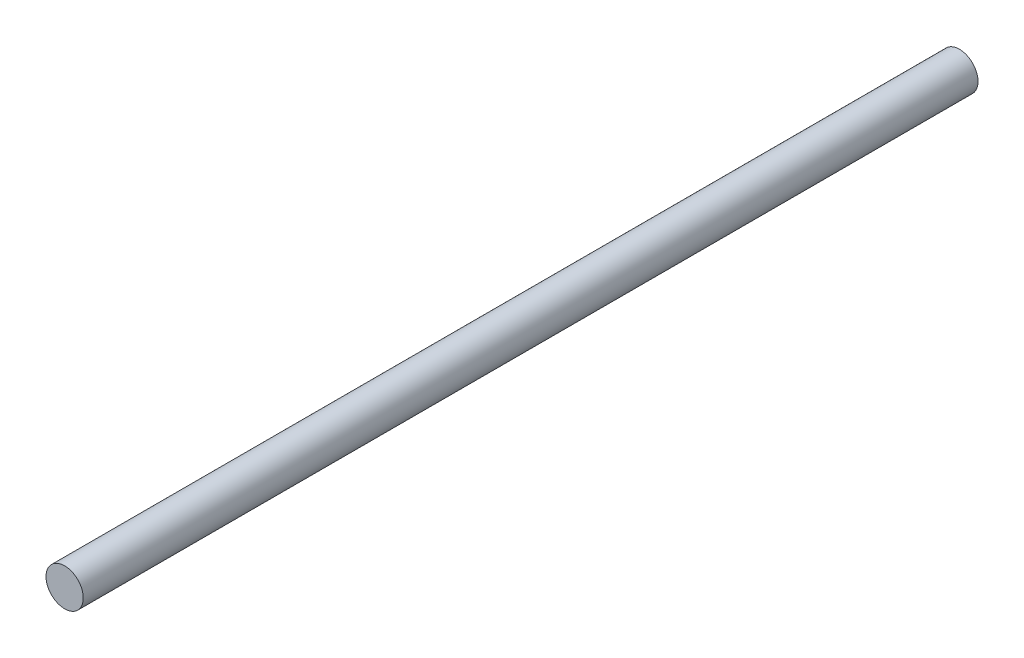
ISO-10303-21;
HEADER;
FILE_DESCRIPTION(('STEP AP214'),'2;1');
FILE_NAME('part.step','',(''),(''),'','','');
FILE_SCHEMA(('AUTOMOTIVE_DESIGN { 1 0 10303 214 1 1 1 1 }'));
ENDSEC;
DATA;
#1=APPLICATION_CONTEXT('core data for automotive mechanical design processes');
#2=APPLICATION_PROTOCOL_DEFINITION('international standard','automotive_design',2000,#1);
#3=PRODUCT_CONTEXT('',#1,'mechanical');
#4=PRODUCT('Part','Part','',(#3));
#5=PRODUCT_RELATED_PRODUCT_CATEGORY('part','',(#4));
#6=PRODUCT_DEFINITION_FORMATION('','',#4);
#7=PRODUCT_DEFINITION_CONTEXT('part definition',#1,'design');
#8=PRODUCT_DEFINITION('design','',#6,#7);
#9=PRODUCT_DEFINITION_SHAPE('','',#8);
#10=(LENGTH_UNIT() NAMED_UNIT(*) SI_UNIT(.MILLI.,.METRE.));
#11=(NAMED_UNIT(*) PLANE_ANGLE_UNIT() SI_UNIT($,.RADIAN.));
#12=(NAMED_UNIT(*) SI_UNIT($,.STERADIAN.) SOLID_ANGLE_UNIT());
#13=UNCERTAINTY_MEASURE_WITH_UNIT(LENGTH_MEASURE(1.E-05),#10,'distance_accuracy_value','');
#14=(GEOMETRIC_REPRESENTATION_CONTEXT(3) GLOBAL_UNCERTAINTY_ASSIGNED_CONTEXT((#13)) GLOBAL_UNIT_ASSIGNED_CONTEXT((#10,
#11,#12)) REPRESENTATION_CONTEXT('',''));
#15=CARTESIAN_POINT('',(0.,0.,0.));
#16=DIRECTION('',(0.,0.,1.));
#17=DIRECTION('',(1.,0.,0.));
#18=AXIS2_PLACEMENT_3D('',#15,#16,#17);
#19=CARTESIAN_POINT('',(0.,0.,152.4));
#20=DIRECTION('',(0.,0.,-1.));
#21=DIRECTION('',(-1.,0.,0.));
#22=AXIS2_PLACEMENT_3D('',#19,#20,#21);
#23=CYLINDRICAL_SURFACE('',#22,3.175);
#24=CARTESIAN_POINT('',(0.,0.,152.4));
#25=DIRECTION('',(0.,0.,1.));
#26=DIRECTION('',(1.,0.,0.));
#27=AXIS2_PLACEMENT_3D('',#24,#25,#26);
#28=CIRCLE('',#27,3.175);
#29=CARTESIAN_POINT('',(-3.175,0.,152.4));
#30=VERTEX_POINT('',#29);
#31=EDGE_CURVE('E10',#30,#30,#28,.T.);
#32=CARTESIAN_POINT('',(0.,0.,0.));
#33=DIRECTION('',(0.,0.,1.));
#34=DIRECTION('',(1.,0.,0.));
#35=AXIS2_PLACEMENT_3D('',#32,#33,#34);
#36=CIRCLE('',#35,3.175);
#37=CARTESIAN_POINT('',(-3.175,0.,0.));
#38=VERTEX_POINT('',#37);
#39=EDGE_CURVE('E46',#38,#38,#36,.T.);
#40=CARTESIAN_POINT('',(-3.175,0.,152.4));
#41=CARTESIAN_POINT('',(-3.175,0.,150.8125));
#42=CARTESIAN_POINT('',(-3.175,0.,149.225));
#43=CARTESIAN_POINT('',(-3.175,0.,146.05));
#44=CARTESIAN_POINT('',(-3.175,0.,144.4625));
#45=CARTESIAN_POINT('',(-3.175,0.,141.2875));
#46=CARTESIAN_POINT('',(-3.175,0.,139.7));
#47=CARTESIAN_POINT('',(-3.175,0.,136.525));
#48=CARTESIAN_POINT('',(-3.175,0.,134.9375));
#49=CARTESIAN_POINT('',(-3.175,0.,131.7625));
#50=CARTESIAN_POINT('',(-3.175,0.,130.175));
#51=CARTESIAN_POINT('',(-3.175,0.,127.));
#52=CARTESIAN_POINT('',(-3.175,0.,125.4125));
#53=CARTESIAN_POINT('',(-3.175,0.,122.2375));
#54=CARTESIAN_POINT('',(-3.175,0.,120.65));
#55=CARTESIAN_POINT('',(-3.175,0.,117.475));
#56=CARTESIAN_POINT('',(-3.175,0.,115.8875));
#57=CARTESIAN_POINT('',(-3.175,0.,112.7125));
#58=CARTESIAN_POINT('',(-3.175,0.,111.125));
#59=CARTESIAN_POINT('',(-3.175,0.,107.95));
#60=CARTESIAN_POINT('',(-3.175,0.,106.3625));
#61=CARTESIAN_POINT('',(-3.175,0.,103.1875));
#62=CARTESIAN_POINT('',(-3.175,0.,101.6));
#63=CARTESIAN_POINT('',(-3.175,0.,98.425));
#64=CARTESIAN_POINT('',(-3.175,0.,96.8375));
#65=CARTESIAN_POINT('',(-3.175,0.,93.6625));
#66=CARTESIAN_POINT('',(-3.175,0.,92.075));
#67=CARTESIAN_POINT('',(-3.175,0.,88.9));
#68=CARTESIAN_POINT('',(-3.175,0.,87.3125));
#69=CARTESIAN_POINT('',(-3.175,0.,84.1375));
#70=CARTESIAN_POINT('',(-3.175,0.,82.55));
#71=CARTESIAN_POINT('',(-3.175,0.,79.375));
#72=CARTESIAN_POINT('',(-3.175,0.,77.7875));
#73=CARTESIAN_POINT('',(-3.175,0.,74.6125));
#74=CARTESIAN_POINT('',(-3.175,0.,73.025));
#75=CARTESIAN_POINT('',(-3.175,0.,69.85));
#76=CARTESIAN_POINT('',(-3.175,0.,68.2625));
#77=CARTESIAN_POINT('',(-3.175,0.,65.0875));
#78=CARTESIAN_POINT('',(-3.175,0.,63.5));
#79=CARTESIAN_POINT('',(-3.175,0.,60.325));
#80=CARTESIAN_POINT('',(-3.175,0.,58.7375));
#81=CARTESIAN_POINT('',(-3.175,0.,55.5625));
#82=CARTESIAN_POINT('',(-3.175,0.,53.975));
#83=CARTESIAN_POINT('',(-3.175,0.,50.8));
#84=CARTESIAN_POINT('',(-3.175,0.,49.2125));
#85=CARTESIAN_POINT('',(-3.175,0.,46.0375));
#86=CARTESIAN_POINT('',(-3.175,0.,44.45));
#87=CARTESIAN_POINT('',(-3.175,0.,41.275));
#88=CARTESIAN_POINT('',(-3.175,0.,39.6875));
#89=CARTESIAN_POINT('',(-3.175,0.,36.5125));
#90=CARTESIAN_POINT('',(-3.175,0.,34.925));
#91=CARTESIAN_POINT('',(-3.175,0.,31.75));
#92=CARTESIAN_POINT('',(-3.175,0.,30.1625));
#93=CARTESIAN_POINT('',(-3.175,0.,26.9875));
#94=CARTESIAN_POINT('',(-3.175,0.,25.4));
#95=CARTESIAN_POINT('',(-3.175,0.,22.225));
#96=CARTESIAN_POINT('',(-3.175,0.,20.6375));
#97=CARTESIAN_POINT('',(-3.175,0.,17.4625));
#98=CARTESIAN_POINT('',(-3.175,0.,15.875));
#99=CARTESIAN_POINT('',(-3.175,0.,12.7));
#100=CARTESIAN_POINT('',(-3.175,0.,11.1125));
#101=CARTESIAN_POINT('',(-3.175,0.,7.93750000000001));
#102=CARTESIAN_POINT('',(-3.175,0.,6.35));
#103=CARTESIAN_POINT('',(-3.175,0.,3.175));
#104=CARTESIAN_POINT('',(-3.175,0.,1.5875));
#105=CARTESIAN_POINT('',(-3.175,0.,0.));
#106=B_SPLINE_CURVE_WITH_KNOTS('',3,(#40,#41,#42,#43,#44,#45,#46,#47,#48,#49,#50,#51,#52,#53,
#54,#55,#56,#57,#58,#59,#60,#61,#62,#63,#64,#65,#66,#67,#68,#69,#70,#71,#72,#73,#74,#75,#76,#77,
#78,#79,#80,#81,#82,#83,#84,#85,#86,#87,#88,#89,#90,#91,#92,#93,#94,#95,#96,#97,#98,#99,#100,
#101,#102,#103,#104,#105),.UNSPECIFIED.,.F.,.F.,(4,2,2,2,2,2,2,2,2,2,2,2,2,2,2,2,2,2,2,2,2,2,2,
2,2,2,2,2,2,2,2,2,4),(0.,4.7625,9.52500000000001,14.2875,19.05,23.8125,28.575,33.3375,38.1,
42.8625,47.625,52.3875,57.15,61.9125,66.675,71.4375,76.2,80.9625,85.725,90.4875,95.25,100.0125,
104.775,109.5375,114.3,119.0625,123.825,128.5875,133.35,138.1125,142.875,147.6375,152.4),.UNSPECIFIED.);
#107=EDGE_CURVE('BSEAM43',#30,#38,#106,.T.);
#108=ORIENTED_EDGE('',*,*,#31,.F.);
#109=ORIENTED_EDGE('',*,*,#39,.T.);
#110=ORIENTED_EDGE('',*,*,#107,.T.);
#111=ORIENTED_EDGE('',*,*,#107,.F.);
#112=EDGE_LOOP('',(#108,#110,#109,#111));
#113=FACE_BOUND('',#112,.T.);
#114=ADVANCED_FACE('F43',(#113),#23,.T.);
#115=CARTESIAN_POINT('',(0.,0.,152.4));
#116=DIRECTION('',(0.,0.,1.));
#117=DIRECTION('',(1.,0.,0.));
#118=AXIS2_PLACEMENT_3D('',#115,#116,#117);
#119=PLANE('',#118);
#120=ORIENTED_EDGE('',*,*,#31,.T.);
#121=EDGE_LOOP('',(#120));
#122=FACE_BOUND('',#121,.T.);
#123=ADVANCED_FACE('F60',(#122),#119,.T.);
#124=CARTESIAN_POINT('',(0.,0.,0.));
#125=DIRECTION('',(0.,0.,1.));
#126=DIRECTION('',(1.,0.,0.));
#127=AXIS2_PLACEMENT_3D('',#124,#125,#126);
#128=PLANE('',#127);
#129=ORIENTED_EDGE('',*,*,#39,.F.);
#130=EDGE_LOOP('',(#129));
#131=FACE_BOUND('',#130,.T.);
#132=ADVANCED_FACE('F58',(#131),#128,.F.);
#133=CLOSED_SHELL('',(#114,#123,#132));
#134=MANIFOLD_SOLID_BREP('B2',#133);
#135=ADVANCED_BREP_SHAPE_REPRESENTATION('',(#18,#134),#14);
#136=SHAPE_DEFINITION_REPRESENTATION(#9,#135);
ENDSEC;
END-ISO-10303-21;
